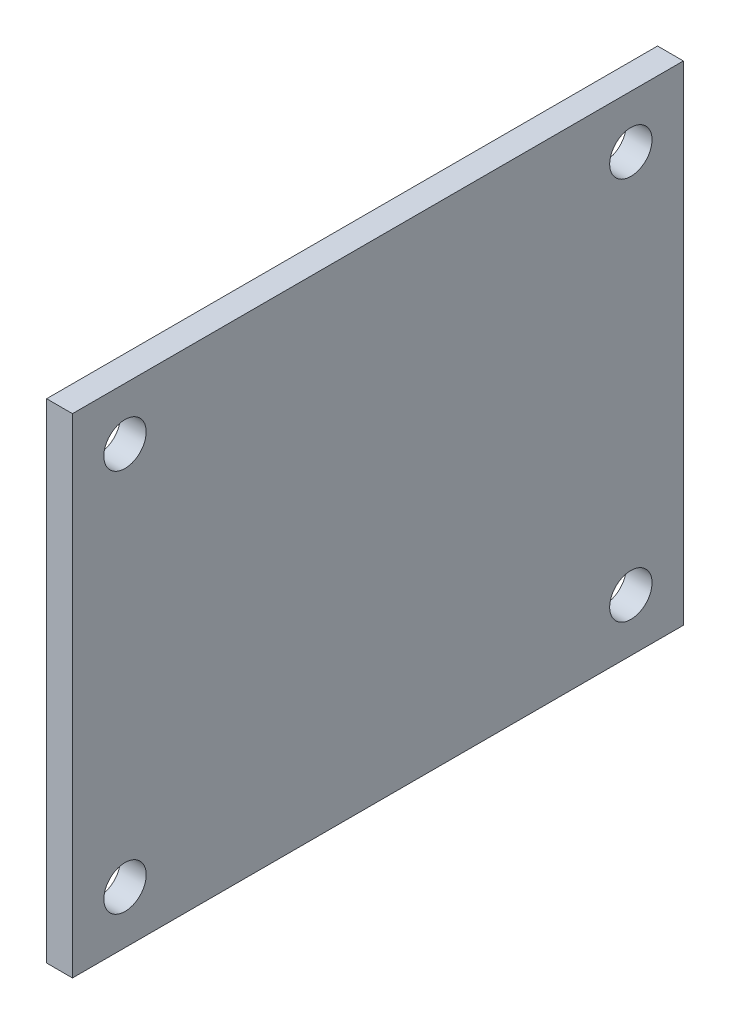
ISO-10303-21;
HEADER;
FILE_DESCRIPTION(('STEP AP214'),'2;1');
FILE_NAME('part.step','',(''),(''),'','','');
FILE_SCHEMA(('AUTOMOTIVE_DESIGN { 1 0 10303 214 1 1 1 1 }'));
ENDSEC;
DATA;
#1=APPLICATION_CONTEXT('core data for automotive mechanical design processes');
#2=APPLICATION_PROTOCOL_DEFINITION('international standard','automotive_design',2000,#1);
#3=PRODUCT_CONTEXT('',#1,'mechanical');
#4=PRODUCT('Part','Part','',(#3));
#5=PRODUCT_RELATED_PRODUCT_CATEGORY('part','',(#4));
#6=PRODUCT_DEFINITION_FORMATION('','',#4);
#7=PRODUCT_DEFINITION_CONTEXT('part definition',#1,'design');
#8=PRODUCT_DEFINITION('design','',#6,#7);
#9=PRODUCT_DEFINITION_SHAPE('','',#8);
#10=(LENGTH_UNIT() NAMED_UNIT(*) SI_UNIT(.MILLI.,.METRE.));
#11=(NAMED_UNIT(*) PLANE_ANGLE_UNIT() SI_UNIT($,.RADIAN.));
#12=(NAMED_UNIT(*) SI_UNIT($,.STERADIAN.) SOLID_ANGLE_UNIT());
#13=UNCERTAINTY_MEASURE_WITH_UNIT(LENGTH_MEASURE(1.E-05),#10,'distance_accuracy_value','');
#14=(GEOMETRIC_REPRESENTATION_CONTEXT(3) GLOBAL_UNCERTAINTY_ASSIGNED_CONTEXT((#13)) GLOBAL_UNIT_ASSIGNED_CONTEXT((#10,
#11,#12)) REPRESENTATION_CONTEXT('',''));
#15=CARTESIAN_POINT('',(0.,0.,0.));
#16=DIRECTION('',(0.,0.,1.));
#17=DIRECTION('',(1.,0.,0.));
#18=AXIS2_PLACEMENT_3D('',#15,#16,#17);
#19=CARTESIAN_POINT('',(-1.5875,-30.,-37.5));
#20=DIRECTION('',(0.,0.,-1.));
#21=DIRECTION('',(-1.,0.,0.));
#22=AXIS2_PLACEMENT_3D('',#19,#20,#21);
#23=PLANE('',#22);
#24=DIRECTION('',(1.,0.,0.));
#25=VECTOR('',#24,1.);
#26=CARTESIAN_POINT('',(-1.5875,30.,-37.5));
#27=LINE('',#26,#25);
#28=CARTESIAN_POINT('',(-1.5875,30.,-37.5));
#29=VERTEX_POINT('',#28);
#30=CARTESIAN_POINT('',(1.5875,30.,-37.5));
#31=VERTEX_POINT('',#30);
#32=EDGE_CURVE('E38',#29,#31,#27,.T.);
#33=ORIENTED_EDGE('',*,*,#32,.T.);
#34=DIRECTION('',(0.,1.,0.));
#35=VECTOR('',#34,1.);
#36=CARTESIAN_POINT('',(1.5875,-30.,-37.5));
#37=LINE('',#36,#35);
#38=CARTESIAN_POINT('',(1.5875,-30.,-37.5));
#39=VERTEX_POINT('',#38);
#40=EDGE_CURVE('E75',#39,#31,#37,.T.);
#41=ORIENTED_EDGE('',*,*,#40,.F.);
#42=DIRECTION('',(1.,0.,0.));
#43=VECTOR('',#42,1.);
#44=CARTESIAN_POINT('',(-1.5875,-30.,-37.5));
#45=LINE('',#44,#43);
#46=CARTESIAN_POINT('',(-1.5875,-30.,-37.5));
#47=VERTEX_POINT('',#46);
#48=EDGE_CURVE('E11',#47,#39,#45,.T.);
#49=ORIENTED_EDGE('',*,*,#48,.F.);
#50=DIRECTION('',(0.,1.,0.));
#51=VECTOR('',#50,1.);
#52=CARTESIAN_POINT('',(-1.5875,-30.,-37.5));
#53=LINE('',#52,#51);
#54=EDGE_CURVE('E76',#47,#29,#53,.T.);
#55=ORIENTED_EDGE('',*,*,#54,.T.);
#56=EDGE_LOOP('',(#33,#41,#49,#55));
#57=FACE_BOUND('',#56,.T.);
#58=ADVANCED_FACE('F35',(#57),#23,.T.);
#59=CARTESIAN_POINT('',(-1.5875,-30.,37.5));
#60=DIRECTION('',(0.,-1.,0.));
#61=DIRECTION('',(0.,0.,-1.));
#62=AXIS2_PLACEMENT_3D('',#59,#60,#61);
#63=PLANE('',#62);
#64=ORIENTED_EDGE('',*,*,#48,.T.);
#65=DIRECTION('',(0.,0.,-1.));
#66=VECTOR('',#65,1.);
#67=CARTESIAN_POINT('',(1.5875,-30.,37.5));
#68=LINE('',#67,#66);
#69=CARTESIAN_POINT('',(1.5875,-30.,37.5));
#70=VERTEX_POINT('',#69);
#71=EDGE_CURVE('E92',#70,#39,#68,.T.);
#72=ORIENTED_EDGE('',*,*,#71,.F.);
#73=DIRECTION('',(1.,0.,0.));
#74=VECTOR('',#73,1.);
#75=CARTESIAN_POINT('',(-1.5875,-30.,37.5));
#76=LINE('',#75,#74);
#77=CARTESIAN_POINT('',(-1.5875,-30.,37.5));
#78=VERTEX_POINT('',#77);
#79=EDGE_CURVE('E43',#78,#70,#76,.T.);
#80=ORIENTED_EDGE('',*,*,#79,.F.);
#81=DIRECTION('',(0.,0.,-1.));
#82=VECTOR('',#81,1.);
#83=CARTESIAN_POINT('',(-1.5875,-30.,37.5));
#84=LINE('',#83,#82);
#85=EDGE_CURVE('E81',#78,#47,#84,.T.);
#86=ORIENTED_EDGE('',*,*,#85,.T.);
#87=EDGE_LOOP('',(#64,#72,#80,#86));
#88=FACE_BOUND('',#87,.T.);
#89=ADVANCED_FACE('F112',(#88),#63,.T.);
#90=CARTESIAN_POINT('',(-1.5875,-30.,37.5));
#91=DIRECTION('',(0.,0.,1.));
#92=DIRECTION('',(1.,0.,0.));
#93=AXIS2_PLACEMENT_3D('',#90,#91,#92);
#94=PLANE('',#93);
#95=ORIENTED_EDGE('',*,*,#79,.T.);
#96=DIRECTION('',(0.,-1.,0.));
#97=VECTOR('',#96,1.);
#98=CARTESIAN_POINT('',(1.5875,-30.,37.5));
#99=LINE('',#98,#97);
#100=CARTESIAN_POINT('',(1.5875,30.,37.5));
#101=VERTEX_POINT('',#100);
#102=EDGE_CURVE('E88',#101,#70,#99,.T.);
#103=ORIENTED_EDGE('',*,*,#102,.F.);
#104=DIRECTION('',(1.,0.,0.));
#105=VECTOR('',#104,1.);
#106=CARTESIAN_POINT('',(-1.5875,30.,37.5));
#107=LINE('',#106,#105);
#108=CARTESIAN_POINT('',(-1.5875,30.,37.5));
#109=VERTEX_POINT('',#108);
#110=EDGE_CURVE('E80',#109,#101,#107,.T.);
#111=ORIENTED_EDGE('',*,*,#110,.F.);
#112=DIRECTION('',(0.,-1.,0.));
#113=VECTOR('',#112,1.);
#114=CARTESIAN_POINT('',(-1.5875,-30.,37.5));
#115=LINE('',#114,#113);
#116=EDGE_CURVE('E105',#109,#78,#115,.T.);
#117=ORIENTED_EDGE('',*,*,#116,.T.);
#118=EDGE_LOOP('',(#95,#103,#111,#117));
#119=FACE_BOUND('',#118,.T.);
#120=ADVANCED_FACE('F109',(#119),#94,.T.);
#121=CARTESIAN_POINT('',(-1.5875,30.,37.5));
#122=DIRECTION('',(0.,1.,0.));
#123=DIRECTION('',(0.,0.,1.));
#124=AXIS2_PLACEMENT_3D('',#121,#122,#123);
#125=PLANE('',#124);
#126=ORIENTED_EDGE('',*,*,#110,.T.);
#127=DIRECTION('',(0.,0.,1.));
#128=VECTOR('',#127,1.);
#129=CARTESIAN_POINT('',(1.5875,30.,37.5));
#130=LINE('',#129,#128);
#131=EDGE_CURVE('E83',#31,#101,#130,.T.);
#132=ORIENTED_EDGE('',*,*,#131,.F.);
#133=ORIENTED_EDGE('',*,*,#32,.F.);
#134=DIRECTION('',(0.,0.,1.));
#135=VECTOR('',#134,1.);
#136=CARTESIAN_POINT('',(-1.5875,30.,37.5));
#137=LINE('',#136,#135);
#138=EDGE_CURVE('E103',#29,#109,#137,.T.);
#139=ORIENTED_EDGE('',*,*,#138,.T.);
#140=EDGE_LOOP('',(#126,#132,#133,#139));
#141=FACE_BOUND('',#140,.T.);
#142=ADVANCED_FACE('F84',(#141),#125,.T.);
#143=CARTESIAN_POINT('',(-1.5875,0.,0.));
#144=DIRECTION('',(-1.,0.,0.));
#145=DIRECTION('',(0.,0.,1.));
#146=AXIS2_PLACEMENT_3D('',#143,#144,#145);
#147=PLANE('',#146);
#148=CARTESIAN_POINT('',(-1.5875,-23.55,31.05));
#149=DIRECTION('',(1.,0.,0.));
#150=DIRECTION('',(0.,0.,1.));
#151=AXIS2_PLACEMENT_3D('',#148,#149,#150);
#152=CIRCLE('',#151,2.6);
#153=CARTESIAN_POINT('',(-1.5875,-23.55,33.65));
#154=VERTEX_POINT('',#153);
#155=EDGE_CURVE('E197',#154,#154,#152,.T.);
#156=ORIENTED_EDGE('',*,*,#155,.T.);
#157=EDGE_LOOP('',(#156));
#158=FACE_BOUND('',#157,.T.);
#159=CARTESIAN_POINT('',(-1.5875,-23.55,-31.05));
#160=DIRECTION('',(1.,0.,0.));
#161=DIRECTION('',(0.,0.,-1.));
#162=AXIS2_PLACEMENT_3D('',#159,#160,#161);
#163=CIRCLE('',#162,2.6);
#164=CARTESIAN_POINT('',(-1.5875,-23.55,-33.65));
#165=VERTEX_POINT('',#164);
#166=EDGE_CURVE('E205',#165,#165,#163,.T.);
#167=ORIENTED_EDGE('',*,*,#166,.T.);
#168=EDGE_LOOP('',(#167));
#169=FACE_BOUND('',#168,.T.);
#170=CARTESIAN_POINT('',(-1.5875,23.55,-31.05));
#171=DIRECTION('',(1.,0.,0.));
#172=DIRECTION('',(0.,0.,1.));
#173=AXIS2_PLACEMENT_3D('',#170,#171,#172);
#174=CIRCLE('',#173,2.6);
#175=CARTESIAN_POINT('',(-1.5875,23.55,-28.45));
#176=VERTEX_POINT('',#175);
#177=EDGE_CURVE('E208',#176,#176,#174,.T.);
#178=ORIENTED_EDGE('',*,*,#177,.T.);
#179=EDGE_LOOP('',(#178));
#180=FACE_BOUND('',#179,.T.);
#181=CARTESIAN_POINT('',(-1.5875,23.55,31.05));
#182=DIRECTION('',(1.,0.,0.));
#183=DIRECTION('',(0.,0.,-1.));
#184=AXIS2_PLACEMENT_3D('',#181,#182,#183);
#185=CIRCLE('',#184,2.6);
#186=CARTESIAN_POINT('',(-1.5875,23.55,28.45));
#187=VERTEX_POINT('',#186);
#188=EDGE_CURVE('E93',#187,#187,#185,.T.);
#189=ORIENTED_EDGE('',*,*,#188,.T.);
#190=EDGE_LOOP('',(#189));
#191=FACE_BOUND('',#190,.T.);
#192=ORIENTED_EDGE('',*,*,#54,.F.);
#193=ORIENTED_EDGE('',*,*,#85,.F.);
#194=ORIENTED_EDGE('',*,*,#116,.F.);
#195=ORIENTED_EDGE('',*,*,#138,.F.);
#196=EDGE_LOOP('',(#192,#193,#194,#195));
#197=FACE_BOUND('',#196,.T.);
#198=ADVANCED_FACE('F114',(#158,#169,#180,#191,#197),#147,.T.);
#199=CARTESIAN_POINT('',(1.5875,0.,0.));
#200=DIRECTION('',(-1.,0.,0.));
#201=DIRECTION('',(0.,0.,1.));
#202=AXIS2_PLACEMENT_3D('',#199,#200,#201);
#203=PLANE('',#202);
#204=CARTESIAN_POINT('',(1.5875,-23.55,31.05));
#205=DIRECTION('',(1.,0.,0.));
#206=DIRECTION('',(0.,0.,1.));
#207=AXIS2_PLACEMENT_3D('',#204,#205,#206);
#208=CIRCLE('',#207,2.6);
#209=CARTESIAN_POINT('',(1.5875,-23.55,33.65));
#210=VERTEX_POINT('',#209);
#211=EDGE_CURVE('E200',#210,#210,#208,.T.);
#212=ORIENTED_EDGE('',*,*,#211,.F.);
#213=EDGE_LOOP('',(#212));
#214=FACE_BOUND('',#213,.T.);
#215=CARTESIAN_POINT('',(1.5875,-23.55,-31.05));
#216=DIRECTION('',(1.,0.,0.));
#217=DIRECTION('',(0.,0.,-1.));
#218=AXIS2_PLACEMENT_3D('',#215,#216,#217);
#219=CIRCLE('',#218,2.6);
#220=CARTESIAN_POINT('',(1.5875,-23.55,-33.65));
#221=VERTEX_POINT('',#220);
#222=EDGE_CURVE('E202',#221,#221,#219,.T.);
#223=ORIENTED_EDGE('',*,*,#222,.F.);
#224=EDGE_LOOP('',(#223));
#225=FACE_BOUND('',#224,.T.);
#226=CARTESIAN_POINT('',(1.5875,23.55,-31.05));
#227=DIRECTION('',(1.,0.,0.));
#228=DIRECTION('',(0.,0.,1.));
#229=AXIS2_PLACEMENT_3D('',#226,#227,#228);
#230=CIRCLE('',#229,2.6);
#231=CARTESIAN_POINT('',(1.5875,23.55,-28.45));
#232=VERTEX_POINT('',#231);
#233=EDGE_CURVE('E212',#232,#232,#230,.T.);
#234=ORIENTED_EDGE('',*,*,#233,.F.);
#235=EDGE_LOOP('',(#234));
#236=FACE_BOUND('',#235,.T.);
#237=CARTESIAN_POINT('',(1.5875,23.55,31.05));
#238=DIRECTION('',(1.,0.,0.));
#239=DIRECTION('',(0.,0.,-1.));
#240=AXIS2_PLACEMENT_3D('',#237,#238,#239);
#241=CIRCLE('',#240,2.6);
#242=CARTESIAN_POINT('',(1.5875,23.55,28.45));
#243=VERTEX_POINT('',#242);
#244=EDGE_CURVE('E96',#243,#243,#241,.T.);
#245=ORIENTED_EDGE('',*,*,#244,.F.);
#246=EDGE_LOOP('',(#245));
#247=FACE_BOUND('',#246,.T.);
#248=ORIENTED_EDGE('',*,*,#40,.T.);
#249=ORIENTED_EDGE('',*,*,#131,.T.);
#250=ORIENTED_EDGE('',*,*,#102,.T.);
#251=ORIENTED_EDGE('',*,*,#71,.T.);
#252=EDGE_LOOP('',(#248,#249,#250,#251));
#253=FACE_BOUND('',#252,.T.);
#254=ADVANCED_FACE('F91',(#214,#225,#236,#247,#253),#203,.F.);
#255=CARTESIAN_POINT('',(-1.5875,23.55,31.05));
#256=DIRECTION('',(1.,0.,0.));
#257=DIRECTION('',(0.,0.,-1.));
#258=AXIS2_PLACEMENT_3D('',#255,#256,#257);
#259=CYLINDRICAL_SURFACE('',#258,2.6);
#260=ORIENTED_EDGE('',*,*,#188,.F.);
#261=EDGE_LOOP('',(#260));
#262=FACE_BOUND('',#261,.T.);
#263=ORIENTED_EDGE('',*,*,#244,.T.);
#264=EDGE_LOOP('',(#263));
#265=FACE_BOUND('',#264,.T.);
#266=ADVANCED_FACE('F122',(#262,#265),#259,.F.);
#267=CARTESIAN_POINT('',(-1.5875,23.55,-31.05));
#268=DIRECTION('',(1.,0.,0.));
#269=DIRECTION('',(0.,0.,-1.));
#270=AXIS2_PLACEMENT_3D('',#267,#268,#269);
#271=CYLINDRICAL_SURFACE('',#270,2.6);
#272=ORIENTED_EDGE('',*,*,#177,.F.);
#273=EDGE_LOOP('',(#272));
#274=FACE_BOUND('',#273,.T.);
#275=ORIENTED_EDGE('',*,*,#233,.T.);
#276=EDGE_LOOP('',(#275));
#277=FACE_BOUND('',#276,.T.);
#278=ADVANCED_FACE('F161',(#274,#277),#271,.F.);
#279=CARTESIAN_POINT('',(-1.5875,-23.55,-31.05));
#280=DIRECTION('',(1.,0.,0.));
#281=DIRECTION('',(0.,0.,-1.));
#282=AXIS2_PLACEMENT_3D('',#279,#280,#281);
#283=CYLINDRICAL_SURFACE('',#282,2.6);
#284=ORIENTED_EDGE('',*,*,#166,.F.);
#285=EDGE_LOOP('',(#284));
#286=FACE_BOUND('',#285,.T.);
#287=ORIENTED_EDGE('',*,*,#222,.T.);
#288=EDGE_LOOP('',(#287));
#289=FACE_BOUND('',#288,.T.);
#290=ADVANCED_FACE('F171',(#286,#289),#283,.F.);
#291=CARTESIAN_POINT('',(-1.5875,-23.55,31.05));
#292=DIRECTION('',(1.,0.,0.));
#293=DIRECTION('',(0.,0.,-1.));
#294=AXIS2_PLACEMENT_3D('',#291,#292,#293);
#295=CYLINDRICAL_SURFACE('',#294,2.6);
#296=ORIENTED_EDGE('',*,*,#155,.F.);
#297=EDGE_LOOP('',(#296));
#298=FACE_BOUND('',#297,.T.);
#299=ORIENTED_EDGE('',*,*,#211,.T.);
#300=EDGE_LOOP('',(#299));
#301=FACE_BOUND('',#300,.T.);
#302=ADVANCED_FACE('F181',(#298,#301),#295,.F.);
#303=CLOSED_SHELL('',(#58,#89,#120,#142,#198,#254,#266,#278,#290,#302));
#304=MANIFOLD_SOLID_BREP('B2',#303);
#305=ADVANCED_BREP_SHAPE_REPRESENTATION('',(#18,#304),#14);
#306=SHAPE_DEFINITION_REPRESENTATION(#9,#305);
ENDSEC;
END-ISO-10303-21;
